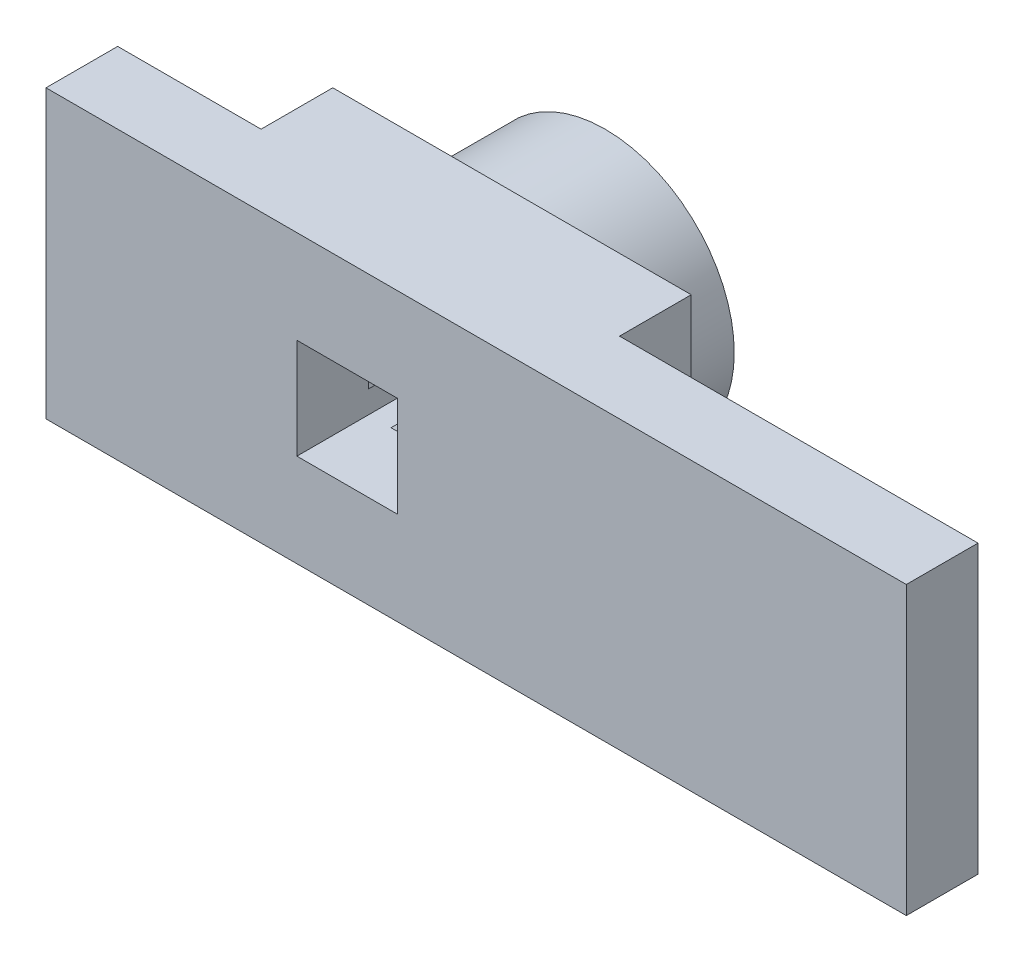
ISO-10303-21;
HEADER;
FILE_DESCRIPTION(('STEP AP214'),'2;1');
FILE_NAME('part.step','',(''),(''),'','','');
FILE_SCHEMA(('AUTOMOTIVE_DESIGN { 1 0 10303 214 1 1 1 1 }'));
ENDSEC;
DATA;
#1=APPLICATION_CONTEXT('core data for automotive mechanical design processes');
#2=APPLICATION_PROTOCOL_DEFINITION('international standard','automotive_design',2000,#1);
#3=PRODUCT_CONTEXT('',#1,'mechanical');
#4=PRODUCT('Part','Part','',(#3));
#5=PRODUCT_RELATED_PRODUCT_CATEGORY('part','',(#4));
#6=PRODUCT_DEFINITION_FORMATION('','',#4);
#7=PRODUCT_DEFINITION_CONTEXT('part definition',#1,'design');
#8=PRODUCT_DEFINITION('design','',#6,#7);
#9=PRODUCT_DEFINITION_SHAPE('','',#8);
#10=(LENGTH_UNIT() NAMED_UNIT(*) SI_UNIT(.MILLI.,.METRE.));
#11=(NAMED_UNIT(*) PLANE_ANGLE_UNIT() SI_UNIT($,.RADIAN.));
#12=(NAMED_UNIT(*) SI_UNIT($,.STERADIAN.) SOLID_ANGLE_UNIT());
#13=UNCERTAINTY_MEASURE_WITH_UNIT(LENGTH_MEASURE(1.E-05),#10,'distance_accuracy_value','');
#14=(GEOMETRIC_REPRESENTATION_CONTEXT(3) GLOBAL_UNCERTAINTY_ASSIGNED_CONTEXT((#13)) GLOBAL_UNIT_ASSIGNED_CONTEXT((#10,
#11,#12)) REPRESENTATION_CONTEXT('',''));
#15=CARTESIAN_POINT('',(0.,0.,0.));
#16=DIRECTION('',(0.,0.,1.));
#17=DIRECTION('',(1.,0.,0.));
#18=AXIS2_PLACEMENT_3D('',#15,#16,#17);
#19=CARTESIAN_POINT('',(-39.,10.,0.));
#20=DIRECTION('',(0.,0.,-1.));
#21=DIRECTION('',(-1.,0.,0.));
#22=AXIS2_PLACEMENT_3D('',#19,#20,#21);
#23=PLANE('',#22);
#24=DIRECTION('',(0.,-1.,0.));
#25=VECTOR('',#24,1.);
#26=CARTESIAN_POINT('',(-42.5,13.5,0.));
#27=LINE('',#26,#25);
#28=CARTESIAN_POINT('',(-42.5,13.5,0.));
#29=VERTEX_POINT('',#28);
#30=CARTESIAN_POINT('',(-42.5,11.9364916731037,0.));
#31=VERTEX_POINT('',#30);
#32=EDGE_CURVE('E239',#29,#31,#27,.T.);
#33=ORIENTED_EDGE('',*,*,#32,.T.);
#34=CARTESIAN_POINT('',(-39.,10.,0.));
#35=DIRECTION('',(0.,0.,-1.));
#36=DIRECTION('',(-1.,0.,0.));
#37=AXIS2_PLACEMENT_3D('',#34,#35,#36);
#38=CIRCLE('',#37,4.00000000000001);
#39=CARTESIAN_POINT('',(-40.9364916731037,13.5,0.));
#40=VERTEX_POINT('',#39);
#41=EDGE_CURVE('E173',#31,#40,#38,.T.);
#42=ORIENTED_EDGE('',*,*,#41,.T.);
#43=DIRECTION('',(-1.,0.,0.));
#44=VECTOR('',#43,1.);
#45=CARTESIAN_POINT('',(-42.5,13.5,0.));
#46=LINE('',#45,#44);
#47=EDGE_CURVE('E250',#40,#29,#46,.T.);
#48=ORIENTED_EDGE('',*,*,#47,.T.);
#49=EDGE_LOOP('',(#33,#42,#48));
#50=FACE_BOUND('',#49,.T.);
#51=ADVANCED_FACE('F33',(#50),#23,.F.);
#52=CARTESIAN_POINT('',(-35.5,13.5,0.));
#53=VERTEX_POINT('',#52);
#54=CARTESIAN_POINT('',(-37.0635083268963,13.5,0.));
#55=VERTEX_POINT('',#54);
#56=EDGE_CURVE('E251',#53,#55,#46,.T.);
#57=ORIENTED_EDGE('',*,*,#56,.T.);
#58=CARTESIAN_POINT('',(-35.5,11.9364916731037,0.));
#59=VERTEX_POINT('',#58);
#60=EDGE_CURVE('E386',#55,#59,#38,.T.);
#61=ORIENTED_EDGE('',*,*,#60,.T.);
#62=DIRECTION('',(0.,1.,0.));
#63=VECTOR('',#62,1.);
#64=CARTESIAN_POINT('',(-35.5,13.5,0.));
#65=LINE('',#64,#63);
#66=EDGE_CURVE('E246',#59,#53,#65,.T.);
#67=ORIENTED_EDGE('',*,*,#66,.T.);
#68=EDGE_LOOP('',(#57,#61,#67));
#69=FACE_BOUND('',#68,.T.);
#70=ADVANCED_FACE('F347',(#69),#23,.F.);
#71=CARTESIAN_POINT('',(-35.5,6.5,0.));
#72=VERTEX_POINT('',#71);
#73=CARTESIAN_POINT('',(-35.5,8.06350832689628,0.));
#74=VERTEX_POINT('',#73);
#75=EDGE_CURVE('E247',#72,#74,#65,.T.);
#76=ORIENTED_EDGE('',*,*,#75,.T.);
#77=CARTESIAN_POINT('',(-37.0635083268963,6.5,0.));
#78=VERTEX_POINT('',#77);
#79=EDGE_CURVE('E375',#74,#78,#38,.T.);
#80=ORIENTED_EDGE('',*,*,#79,.T.);
#81=DIRECTION('',(1.,0.,0.));
#82=VECTOR('',#81,1.);
#83=CARTESIAN_POINT('',(-42.5,6.5,0.));
#84=LINE('',#83,#82);
#85=EDGE_CURVE('E241',#78,#72,#84,.T.);
#86=ORIENTED_EDGE('',*,*,#85,.T.);
#87=EDGE_LOOP('',(#76,#80,#86));
#88=FACE_BOUND('',#87,.T.);
#89=ADVANCED_FACE('F345',(#88),#23,.F.);
#90=CARTESIAN_POINT('',(-60.,20.,10.));
#91=DIRECTION('',(1.,0.,0.));
#92=DIRECTION('',(0.,1.,0.));
#93=AXIS2_PLACEMENT_3D('',#90,#91,#92);
#94=PLANE('',#93);
#95=DIRECTION('',(0.,0.,-1.));
#96=VECTOR('',#95,1.);
#97=CARTESIAN_POINT('',(-60.,20.,10.));
#98=LINE('',#97,#96);
#99=CARTESIAN_POINT('',(-60.,20.,10.));
#100=VERTEX_POINT('',#99);
#101=CARTESIAN_POINT('',(-60.,20.,5.));
#102=VERTEX_POINT('',#101);
#103=EDGE_CURVE('E284',#100,#102,#98,.T.);
#104=ORIENTED_EDGE('',*,*,#103,.T.);
#105=DIRECTION('',(0.,-1.,0.));
#106=VECTOR('',#105,1.);
#107=CARTESIAN_POINT('',(-60.,20.,5.));
#108=LINE('',#107,#106);
#109=CARTESIAN_POINT('',(-60.,0.,5.));
#110=VERTEX_POINT('',#109);
#111=EDGE_CURVE('E232',#102,#110,#108,.T.);
#112=ORIENTED_EDGE('',*,*,#111,.T.);
#113=DIRECTION('',(0.,0.,-1.));
#114=VECTOR('',#113,1.);
#115=CARTESIAN_POINT('',(-60.,0.,10.));
#116=LINE('',#115,#114);
#117=CARTESIAN_POINT('',(-60.,0.,10.));
#118=VERTEX_POINT('',#117);
#119=EDGE_CURVE('E296',#118,#110,#116,.T.);
#120=ORIENTED_EDGE('',*,*,#119,.F.);
#121=DIRECTION('',(0.,-1.,0.));
#122=VECTOR('',#121,1.);
#123=CARTESIAN_POINT('',(-60.,20.,10.));
#124=LINE('',#123,#122);
#125=EDGE_CURVE('E274',#100,#118,#124,.T.);
#126=ORIENTED_EDGE('',*,*,#125,.F.);
#127=EDGE_LOOP('',(#104,#112,#120,#126));
#128=FACE_BOUND('',#127,.T.);
#129=ADVANCED_FACE('F35',(#128),#94,.F.);
#130=CARTESIAN_POINT('',(-60.,0.,10.));
#131=DIRECTION('',(0.,1.,0.));
#132=DIRECTION('',(0.,0.,1.));
#133=AXIS2_PLACEMENT_3D('',#130,#131,#132);
#134=PLANE('',#133);
#135=DIRECTION('',(1.,0.,0.));
#136=VECTOR('',#135,1.);
#137=CARTESIAN_POINT('',(-60.,0.,0.));
#138=LINE('',#137,#136);
#139=CARTESIAN_POINT('',(-50.,0.,0.));
#140=VERTEX_POINT('',#139);
#141=CARTESIAN_POINT('',(-25.,0.,0.));
#142=VERTEX_POINT('',#141);
#143=EDGE_CURVE('E267',#140,#142,#138,.T.);
#144=ORIENTED_EDGE('',*,*,#143,.T.);
#145=DIRECTION('',(0.,0.,-1.));
#146=VECTOR('',#145,1.);
#147=CARTESIAN_POINT('',(-25.,0.,4.99999999999999));
#148=LINE('',#147,#146);
#149=CARTESIAN_POINT('',(-25.,0.,4.99999999999999));
#150=VERTEX_POINT('',#149);
#151=EDGE_CURVE('E56',#150,#142,#148,.T.);
#152=ORIENTED_EDGE('',*,*,#151,.F.);
#153=DIRECTION('',(-1.,0.,0.));
#154=VECTOR('',#153,1.);
#155=CARTESIAN_POINT('',(-25.,0.,4.99999999999999));
#156=LINE('',#155,#154);
#157=CARTESIAN_POINT('',(0.,0.,5.));
#158=VERTEX_POINT('',#157);
#159=EDGE_CURVE('E204',#158,#150,#156,.T.);
#160=ORIENTED_EDGE('',*,*,#159,.F.);
#161=DIRECTION('',(0.,0.,-1.));
#162=VECTOR('',#161,1.);
#163=CARTESIAN_POINT('',(0.,0.,10.));
#164=LINE('',#163,#162);
#165=CARTESIAN_POINT('',(0.,0.,10.));
#166=VERTEX_POINT('',#165);
#167=EDGE_CURVE('E293',#166,#158,#164,.T.);
#168=ORIENTED_EDGE('',*,*,#167,.F.);
#169=DIRECTION('',(1.,0.,0.));
#170=VECTOR('',#169,1.);
#171=CARTESIAN_POINT('',(-60.,0.,10.));
#172=LINE('',#171,#170);
#173=EDGE_CURVE('E277',#118,#166,#172,.T.);
#174=ORIENTED_EDGE('',*,*,#173,.F.);
#175=ORIENTED_EDGE('',*,*,#119,.T.);
#176=DIRECTION('',(-1.,0.,0.));
#177=VECTOR('',#176,1.);
#178=CARTESIAN_POINT('',(-60.,0.,5.));
#179=LINE('',#178,#177);
#180=CARTESIAN_POINT('',(-50.,0.,5.));
#181=VERTEX_POINT('',#180);
#182=EDGE_CURVE('E225',#181,#110,#179,.T.);
#183=ORIENTED_EDGE('',*,*,#182,.F.);
#184=DIRECTION('',(0.,0.,1.));
#185=VECTOR('',#184,1.);
#186=CARTESIAN_POINT('',(-50.,0.,0.));
#187=LINE('',#186,#185);
#188=EDGE_CURVE('E217',#140,#181,#187,.T.);
#189=ORIENTED_EDGE('',*,*,#188,.F.);
#190=EDGE_LOOP('',(#144,#152,#160,#168,#174,#175,#183,#189));
#191=FACE_BOUND('',#190,.T.);
#192=ADVANCED_FACE('F338',(#191),#134,.F.);
#193=CARTESIAN_POINT('',(0.,20.,10.));
#194=DIRECTION('',(-1.,0.,0.));
#195=DIRECTION('',(0.,0.,1.));
#196=AXIS2_PLACEMENT_3D('',#193,#194,#195);
#197=PLANE('',#196);
#198=ORIENTED_EDGE('',*,*,#167,.T.);
#199=DIRECTION('',(0.,-1.,0.));
#200=VECTOR('',#199,1.);
#201=CARTESIAN_POINT('',(0.,20.,5.));
#202=LINE('',#201,#200);
#203=CARTESIAN_POINT('',(0.,20.,5.));
#204=VERTEX_POINT('',#203);
#205=EDGE_CURVE('E211',#204,#158,#202,.T.);
#206=ORIENTED_EDGE('',*,*,#205,.F.);
#207=DIRECTION('',(0.,0.,-1.));
#208=VECTOR('',#207,1.);
#209=CARTESIAN_POINT('',(0.,20.,10.));
#210=LINE('',#209,#208);
#211=CARTESIAN_POINT('',(0.,20.,10.));
#212=VERTEX_POINT('',#211);
#213=EDGE_CURVE('E290',#212,#204,#210,.T.);
#214=ORIENTED_EDGE('',*,*,#213,.F.);
#215=DIRECTION('',(0.,1.,0.));
#216=VECTOR('',#215,1.);
#217=CARTESIAN_POINT('',(0.,20.,10.));
#218=LINE('',#217,#216);
#219=EDGE_CURVE('E280',#166,#212,#218,.T.);
#220=ORIENTED_EDGE('',*,*,#219,.F.);
#221=EDGE_LOOP('',(#198,#206,#214,#220));
#222=FACE_BOUND('',#221,.T.);
#223=ADVANCED_FACE('F333',(#222),#197,.F.);
#224=CARTESIAN_POINT('',(-60.,20.,10.));
#225=DIRECTION('',(0.,-1.,0.));
#226=DIRECTION('',(0.,0.,-1.));
#227=AXIS2_PLACEMENT_3D('',#224,#225,#226);
#228=PLANE('',#227);
#229=DIRECTION('',(-1.,0.,0.));
#230=VECTOR('',#229,1.);
#231=CARTESIAN_POINT('',(-25.,20.,4.99999999999999));
#232=LINE('',#231,#230);
#233=CARTESIAN_POINT('',(-25.,20.,4.99999999999999));
#234=VERTEX_POINT('',#233);
#235=EDGE_CURVE('E205',#204,#234,#232,.T.);
#236=ORIENTED_EDGE('',*,*,#235,.T.);
#237=DIRECTION('',(0.,0.,-1.));
#238=VECTOR('',#237,1.);
#239=CARTESIAN_POINT('',(-25.,20.,4.99999999999999));
#240=LINE('',#239,#238);
#241=CARTESIAN_POINT('',(-25.,20.,0.));
#242=VERTEX_POINT('',#241);
#243=EDGE_CURVE('E208',#234,#242,#240,.T.);
#244=ORIENTED_EDGE('',*,*,#243,.T.);
#245=DIRECTION('',(-1.,0.,0.));
#246=VECTOR('',#245,1.);
#247=CARTESIAN_POINT('',(-60.,20.,0.));
#248=LINE('',#247,#246);
#249=CARTESIAN_POINT('',(-50.,20.,0.));
#250=VERTEX_POINT('',#249);
#251=EDGE_CURVE('E278',#242,#250,#248,.T.);
#252=ORIENTED_EDGE('',*,*,#251,.T.);
#253=DIRECTION('',(0.,0.,1.));
#254=VECTOR('',#253,1.);
#255=CARTESIAN_POINT('',(-50.,20.,0.));
#256=LINE('',#255,#254);
#257=CARTESIAN_POINT('',(-50.,20.,5.));
#258=VERTEX_POINT('',#257);
#259=EDGE_CURVE('E221',#250,#258,#256,.T.);
#260=ORIENTED_EDGE('',*,*,#259,.T.);
#261=DIRECTION('',(-1.,0.,0.));
#262=VECTOR('',#261,1.);
#263=CARTESIAN_POINT('',(-60.,20.,5.));
#264=LINE('',#263,#262);
#265=EDGE_CURVE('E224',#258,#102,#264,.T.);
#266=ORIENTED_EDGE('',*,*,#265,.T.);
#267=ORIENTED_EDGE('',*,*,#103,.F.);
#268=DIRECTION('',(-1.,0.,0.));
#269=VECTOR('',#268,1.);
#270=CARTESIAN_POINT('',(-60.,20.,10.));
#271=LINE('',#270,#269);
#272=EDGE_CURVE('E282',#212,#100,#271,.T.);
#273=ORIENTED_EDGE('',*,*,#272,.F.);
#274=ORIENTED_EDGE('',*,*,#213,.T.);
#275=EDGE_LOOP('',(#236,#244,#252,#260,#266,#267,#273,#274));
#276=FACE_BOUND('',#275,.T.);
#277=ADVANCED_FACE('F313',(#276),#228,.F.);
#278=CARTESIAN_POINT('',(0.,0.,10.));
#279=DIRECTION('',(0.,0.,1.));
#280=DIRECTION('',(1.,0.,0.));
#281=AXIS2_PLACEMENT_3D('',#278,#279,#280);
#282=PLANE('',#281);
#283=DIRECTION('',(0.,-1.,0.));
#284=VECTOR('',#283,1.);
#285=CARTESIAN_POINT('',(-42.5,13.5,10.));
#286=LINE('',#285,#284);
#287=CARTESIAN_POINT('',(-42.5,13.5,10.));
#288=VERTEX_POINT('',#287);
#289=CARTESIAN_POINT('',(-42.5,6.5,10.));
#290=VERTEX_POINT('',#289);
#291=EDGE_CURVE('E235',#288,#290,#286,.T.);
#292=ORIENTED_EDGE('',*,*,#291,.F.);
#293=DIRECTION('',(-1.,0.,0.));
#294=VECTOR('',#293,1.);
#295=CARTESIAN_POINT('',(-42.5,13.5,10.));
#296=LINE('',#295,#294);
#297=CARTESIAN_POINT('',(-35.5,13.5,10.));
#298=VERTEX_POINT('',#297);
#299=EDGE_CURVE('E262',#298,#288,#296,.T.);
#300=ORIENTED_EDGE('',*,*,#299,.F.);
#301=DIRECTION('',(0.,1.,0.));
#302=VECTOR('',#301,1.);
#303=CARTESIAN_POINT('',(-35.5,13.5,10.));
#304=LINE('',#303,#302);
#305=CARTESIAN_POINT('',(-35.5,6.5,10.));
#306=VERTEX_POINT('',#305);
#307=EDGE_CURVE('E259',#306,#298,#304,.T.);
#308=ORIENTED_EDGE('',*,*,#307,.F.);
#309=DIRECTION('',(1.,0.,0.));
#310=VECTOR('',#309,1.);
#311=CARTESIAN_POINT('',(-42.5,6.5,10.));
#312=LINE('',#311,#310);
#313=EDGE_CURVE('E256',#290,#306,#312,.T.);
#314=ORIENTED_EDGE('',*,*,#313,.F.);
#315=EDGE_LOOP('',(#292,#300,#308,#314));
#316=FACE_BOUND('',#315,.T.);
#317=ORIENTED_EDGE('',*,*,#125,.T.);
#318=ORIENTED_EDGE('',*,*,#173,.T.);
#319=ORIENTED_EDGE('',*,*,#219,.T.);
#320=ORIENTED_EDGE('',*,*,#272,.T.);
#321=EDGE_LOOP('',(#317,#318,#319,#320));
#322=FACE_BOUND('',#321,.T.);
#323=ADVANCED_FACE('F306',(#316,#322),#282,.T.);
#324=CARTESIAN_POINT('',(0.,0.,0.));
#325=DIRECTION('',(0.,0.,1.));
#326=DIRECTION('',(1.,0.,0.));
#327=AXIS2_PLACEMENT_3D('',#324,#325,#326);
#328=PLANE('',#327);
#329=CARTESIAN_POINT('',(-39.,10.,0.));
#330=DIRECTION('',(0.,0.,1.));
#331=DIRECTION('',(1.,0.,0.));
#332=AXIS2_PLACEMENT_3D('',#329,#330,#331);
#333=CIRCLE('',#332,9.);
#334=CARTESIAN_POINT('',(-30.,10.,0.));
#335=VERTEX_POINT('',#334);
#336=EDGE_CURVE('E41',#335,#335,#333,.F.);
#337=ORIENTED_EDGE('',*,*,#336,.F.);
#338=EDGE_LOOP('',(#337));
#339=FACE_BOUND('',#338,.T.);
#340=ORIENTED_EDGE('',*,*,#251,.F.);
#341=DIRECTION('',(0.,-1.,0.));
#342=VECTOR('',#341,1.);
#343=CARTESIAN_POINT('',(-25.,20.,0.));
#344=LINE('',#343,#342);
#345=EDGE_CURVE('E215',#242,#142,#344,.T.);
#346=ORIENTED_EDGE('',*,*,#345,.T.);
#347=ORIENTED_EDGE('',*,*,#143,.F.);
#348=DIRECTION('',(0.,-1.,0.));
#349=VECTOR('',#348,1.);
#350=CARTESIAN_POINT('',(-50.,20.,0.));
#351=LINE('',#350,#349);
#352=EDGE_CURVE('E228',#250,#140,#351,.T.);
#353=ORIENTED_EDGE('',*,*,#352,.F.);
#354=EDGE_LOOP('',(#340,#346,#347,#353));
#355=FACE_BOUND('',#354,.T.);
#356=ADVANCED_FACE('F303',(#339,#355),#328,.F.);
#357=CARTESIAN_POINT('',(-42.5,13.5,0.));
#358=DIRECTION('',(-1.,0.,0.));
#359=DIRECTION('',(0.,0.,1.));
#360=AXIS2_PLACEMENT_3D('',#357,#358,#359);
#361=PLANE('',#360);
#362=DIRECTION('',(0.,-1.,0.));
#363=VECTOR('',#362,1.);
#364=CARTESIAN_POINT('',(-42.5,13.5,5.));
#365=LINE('',#364,#363);
#366=CARTESIAN_POINT('',(-42.5,11.9364916731037,5.));
#367=VERTEX_POINT('',#366);
#368=CARTESIAN_POINT('',(-42.5,8.06350832689627,5.));
#369=VERTEX_POINT('',#368);
#370=EDGE_CURVE('E183',#367,#369,#365,.T.);
#371=ORIENTED_EDGE('',*,*,#370,.F.);
#372=DIRECTION('',(0.,0.,-1.));
#373=VECTOR('',#372,1.);
#374=CARTESIAN_POINT('',(-42.5,11.9364916731037,5.));
#375=LINE('',#374,#373);
#376=EDGE_CURVE('E168',#367,#31,#375,.T.);
#377=ORIENTED_EDGE('',*,*,#376,.T.);
#378=ORIENTED_EDGE('',*,*,#32,.F.);
#379=DIRECTION('',(0.,0.,1.));
#380=VECTOR('',#379,1.);
#381=CARTESIAN_POINT('',(-42.5,13.5,0.));
#382=LINE('',#381,#380);
#383=EDGE_CURVE('E265',#29,#288,#382,.T.);
#384=ORIENTED_EDGE('',*,*,#383,.T.);
#385=ORIENTED_EDGE('',*,*,#291,.T.);
#386=DIRECTION('',(0.,0.,1.));
#387=VECTOR('',#386,1.);
#388=CARTESIAN_POINT('',(-42.5,6.5,0.));
#389=LINE('',#388,#387);
#390=CARTESIAN_POINT('',(-42.5,6.5,0.));
#391=VERTEX_POINT('',#390);
#392=EDGE_CURVE('E254',#391,#290,#389,.T.);
#393=ORIENTED_EDGE('',*,*,#392,.F.);
#394=CARTESIAN_POINT('',(-42.5,8.06350832689627,0.));
#395=VERTEX_POINT('',#394);
#396=EDGE_CURVE('E242',#395,#391,#27,.T.);
#397=ORIENTED_EDGE('',*,*,#396,.F.);
#398=DIRECTION('',(0.,0.,-1.));
#399=VECTOR('',#398,1.);
#400=CARTESIAN_POINT('',(-42.5,8.06350832689627,5.));
#401=LINE('',#400,#399);
#402=EDGE_CURVE('E48',#395,#369,#401,.F.);
#403=ORIENTED_EDGE('',*,*,#402,.T.);
#404=EDGE_LOOP('',(#371,#377,#378,#384,#385,#393,#397,#403));
#405=FACE_BOUND('',#404,.T.);
#406=ADVANCED_FACE('F188',(#405),#361,.F.);
#407=CARTESIAN_POINT('',(-42.5,13.5,0.));
#408=DIRECTION('',(0.,1.,0.));
#409=DIRECTION('',(-1.,0.,0.));
#410=AXIS2_PLACEMENT_3D('',#407,#408,#409);
#411=PLANE('',#410);
#412=DIRECTION('',(-1.,0.,0.));
#413=VECTOR('',#412,1.);
#414=CARTESIAN_POINT('',(-42.5,13.5,5.));
#415=LINE('',#414,#413);
#416=CARTESIAN_POINT('',(-37.0635083268963,13.5,5.));
#417=VERTEX_POINT('',#416);
#418=CARTESIAN_POINT('',(-40.9364916731037,13.5,5.));
#419=VERTEX_POINT('',#418);
#420=EDGE_CURVE('E191',#417,#419,#415,.T.);
#421=ORIENTED_EDGE('',*,*,#420,.F.);
#422=DIRECTION('',(0.,0.,-1.));
#423=VECTOR('',#422,1.);
#424=CARTESIAN_POINT('',(-37.0635083268963,13.5,5.));
#425=LINE('',#424,#423);
#426=EDGE_CURVE('E397',#417,#55,#425,.T.);
#427=ORIENTED_EDGE('',*,*,#426,.T.);
#428=ORIENTED_EDGE('',*,*,#56,.F.);
#429=DIRECTION('',(0.,0.,1.));
#430=VECTOR('',#429,1.);
#431=CARTESIAN_POINT('',(-35.5,13.5,0.));
#432=LINE('',#431,#430);
#433=EDGE_CURVE('E268',#53,#298,#432,.T.);
#434=ORIENTED_EDGE('',*,*,#433,.T.);
#435=ORIENTED_EDGE('',*,*,#299,.T.);
#436=ORIENTED_EDGE('',*,*,#383,.F.);
#437=ORIENTED_EDGE('',*,*,#47,.F.);
#438=DIRECTION('',(0.,0.,-1.));
#439=VECTOR('',#438,1.);
#440=CARTESIAN_POINT('',(-40.9364916731037,13.5,5.));
#441=LINE('',#440,#439);
#442=EDGE_CURVE('E179',#40,#419,#441,.F.);
#443=ORIENTED_EDGE('',*,*,#442,.T.);
#444=EDGE_LOOP('',(#421,#427,#428,#434,#435,#436,#437,#443));
#445=FACE_BOUND('',#444,.T.);
#446=ADVANCED_FACE('F411',(#445),#411,.F.);
#447=CARTESIAN_POINT('',(-35.5,13.5,0.));
#448=DIRECTION('',(1.,0.,0.));
#449=DIRECTION('',(0.,0.,-1.));
#450=AXIS2_PLACEMENT_3D('',#447,#448,#449);
#451=PLANE('',#450);
#452=DIRECTION('',(0.,1.,0.));
#453=VECTOR('',#452,1.);
#454=CARTESIAN_POINT('',(-35.5,13.5,5.));
#455=LINE('',#454,#453);
#456=CARTESIAN_POINT('',(-35.5,8.06350832689628,5.));
#457=VERTEX_POINT('',#456);
#458=CARTESIAN_POINT('',(-35.5,11.9364916731037,5.));
#459=VERTEX_POINT('',#458);
#460=EDGE_CURVE('E178',#457,#459,#455,.T.);
#461=ORIENTED_EDGE('',*,*,#460,.F.);
#462=DIRECTION('',(0.,0.,-1.));
#463=VECTOR('',#462,1.);
#464=CARTESIAN_POINT('',(-35.5,8.06350832689628,5.));
#465=LINE('',#464,#463);
#466=EDGE_CURVE('E382',#457,#74,#465,.T.);
#467=ORIENTED_EDGE('',*,*,#466,.T.);
#468=ORIENTED_EDGE('',*,*,#75,.F.);
#469=DIRECTION('',(0.,0.,1.));
#470=VECTOR('',#469,1.);
#471=CARTESIAN_POINT('',(-35.5,6.5,0.));
#472=LINE('',#471,#470);
#473=EDGE_CURVE('E270',#72,#306,#472,.T.);
#474=ORIENTED_EDGE('',*,*,#473,.T.);
#475=ORIENTED_EDGE('',*,*,#307,.T.);
#476=ORIENTED_EDGE('',*,*,#433,.F.);
#477=ORIENTED_EDGE('',*,*,#66,.F.);
#478=DIRECTION('',(0.,0.,-1.));
#479=VECTOR('',#478,1.);
#480=CARTESIAN_POINT('',(-35.5,11.9364916731037,5.));
#481=LINE('',#480,#479);
#482=EDGE_CURVE('E390',#59,#459,#481,.F.);
#483=ORIENTED_EDGE('',*,*,#482,.T.);
#484=EDGE_LOOP('',(#461,#467,#468,#474,#475,#476,#477,#483));
#485=FACE_BOUND('',#484,.T.);
#486=ADVANCED_FACE('F381',(#485),#451,.F.);
#487=CARTESIAN_POINT('',(-42.5,6.5,0.));
#488=DIRECTION('',(0.,-1.,0.));
#489=DIRECTION('',(0.,0.,-1.));
#490=AXIS2_PLACEMENT_3D('',#487,#488,#489);
#491=PLANE('',#490);
#492=DIRECTION('',(1.,0.,0.));
#493=VECTOR('',#492,1.);
#494=CARTESIAN_POINT('',(-42.5,6.5,5.));
#495=LINE('',#494,#493);
#496=CARTESIAN_POINT('',(-40.9364916731037,6.5,5.));
#497=VERTEX_POINT('',#496);
#498=CARTESIAN_POINT('',(-37.0635083268963,6.5,5.));
#499=VERTEX_POINT('',#498);
#500=EDGE_CURVE('E11',#497,#499,#495,.T.);
#501=ORIENTED_EDGE('',*,*,#500,.F.);
#502=DIRECTION('',(0.,0.,-1.));
#503=VECTOR('',#502,1.);
#504=CARTESIAN_POINT('',(-40.9364916731037,6.5,5.));
#505=LINE('',#504,#503);
#506=CARTESIAN_POINT('',(-40.9364916731037,6.5,0.));
#507=VERTEX_POINT('',#506);
#508=EDGE_CURVE('E416',#497,#507,#505,.T.);
#509=ORIENTED_EDGE('',*,*,#508,.T.);
#510=EDGE_CURVE('E243',#391,#507,#84,.T.);
#511=ORIENTED_EDGE('',*,*,#510,.F.);
#512=ORIENTED_EDGE('',*,*,#392,.T.);
#513=ORIENTED_EDGE('',*,*,#313,.T.);
#514=ORIENTED_EDGE('',*,*,#473,.F.);
#515=ORIENTED_EDGE('',*,*,#85,.F.);
#516=DIRECTION('',(0.,0.,-1.));
#517=VECTOR('',#516,1.);
#518=CARTESIAN_POINT('',(-37.0635083268963,6.5,5.));
#519=LINE('',#518,#517);
#520=EDGE_CURVE('E387',#78,#499,#519,.F.);
#521=ORIENTED_EDGE('',*,*,#520,.T.);
#522=EDGE_LOOP('',(#501,#509,#511,#512,#513,#514,#515,#521));
#523=FACE_BOUND('',#522,.T.);
#524=ADVANCED_FACE('F424',(#523),#491,.F.);
#525=CARTESIAN_POINT('',(-60.,20.,5.));
#526=DIRECTION('',(0.,0.,1.));
#527=DIRECTION('',(1.,0.,0.));
#528=AXIS2_PLACEMENT_3D('',#525,#526,#527);
#529=PLANE('',#528);
#530=ORIENTED_EDGE('',*,*,#182,.T.);
#531=ORIENTED_EDGE('',*,*,#111,.F.);
#532=ORIENTED_EDGE('',*,*,#265,.F.);
#533=DIRECTION('',(0.,-1.,0.));
#534=VECTOR('',#533,1.);
#535=CARTESIAN_POINT('',(-50.,20.,5.));
#536=LINE('',#535,#534);
#537=EDGE_CURVE('E236',#258,#181,#536,.T.);
#538=ORIENTED_EDGE('',*,*,#537,.T.);
#539=EDGE_LOOP('',(#530,#531,#532,#538));
#540=FACE_BOUND('',#539,.T.);
#541=ADVANCED_FACE('F321',(#540),#529,.F.);
#542=CARTESIAN_POINT('',(-50.,20.,0.));
#543=DIRECTION('',(1.,0.,0.));
#544=DIRECTION('',(0.,0.,-1.));
#545=AXIS2_PLACEMENT_3D('',#542,#543,#544);
#546=PLANE('',#545);
#547=ORIENTED_EDGE('',*,*,#188,.T.);
#548=ORIENTED_EDGE('',*,*,#537,.F.);
#549=ORIENTED_EDGE('',*,*,#259,.F.);
#550=ORIENTED_EDGE('',*,*,#352,.T.);
#551=EDGE_LOOP('',(#547,#548,#549,#550));
#552=FACE_BOUND('',#551,.T.);
#553=ADVANCED_FACE('F316',(#552),#546,.F.);
#554=CARTESIAN_POINT('',(-25.,20.,4.99999999999999));
#555=DIRECTION('',(-1.,0.,0.));
#556=DIRECTION('',(0.,0.,1.));
#557=AXIS2_PLACEMENT_3D('',#554,#555,#556);
#558=PLANE('',#557);
#559=ORIENTED_EDGE('',*,*,#151,.T.);
#560=ORIENTED_EDGE('',*,*,#345,.F.);
#561=ORIENTED_EDGE('',*,*,#243,.F.);
#562=DIRECTION('',(0.,-1.,0.));
#563=VECTOR('',#562,1.);
#564=CARTESIAN_POINT('',(-25.,20.,4.99999999999999));
#565=LINE('',#564,#563);
#566=EDGE_CURVE('E218',#234,#150,#565,.T.);
#567=ORIENTED_EDGE('',*,*,#566,.T.);
#568=EDGE_LOOP('',(#559,#560,#561,#567));
#569=FACE_BOUND('',#568,.T.);
#570=ADVANCED_FACE('F366',(#569),#558,.F.);
#571=CARTESIAN_POINT('',(-25.,20.,4.99999999999999));
#572=DIRECTION('',(0.,0.,1.));
#573=DIRECTION('',(1.,0.,0.));
#574=AXIS2_PLACEMENT_3D('',#571,#572,#573);
#575=PLANE('',#574);
#576=ORIENTED_EDGE('',*,*,#159,.T.);
#577=ORIENTED_EDGE('',*,*,#566,.F.);
#578=ORIENTED_EDGE('',*,*,#235,.F.);
#579=ORIENTED_EDGE('',*,*,#205,.T.);
#580=EDGE_LOOP('',(#576,#577,#578,#579));
#581=FACE_BOUND('',#580,.T.);
#582=ADVANCED_FACE('F336',(#581),#575,.F.);
#583=ORIENTED_EDGE('',*,*,#510,.T.);
#584=EDGE_CURVE('E415',#507,#395,#38,.T.);
#585=ORIENTED_EDGE('',*,*,#584,.T.);
#586=ORIENTED_EDGE('',*,*,#396,.T.);
#587=EDGE_LOOP('',(#583,#585,#586));
#588=FACE_BOUND('',#587,.T.);
#589=ADVANCED_FACE('F350',(#588),#23,.F.);
#590=CARTESIAN_POINT('',(-39.,10.,-8.));
#591=DIRECTION('',(0.,0.,1.));
#592=DIRECTION('',(1.,0.,0.));
#593=AXIS2_PLACEMENT_3D('',#590,#591,#592);
#594=CYLINDRICAL_SURFACE('',#593,9.);
#595=CARTESIAN_POINT('',(-39.,10.,-8.));
#596=DIRECTION('',(0.,0.,-1.));
#597=DIRECTION('',(-1.,0.,0.));
#598=AXIS2_PLACEMENT_3D('',#595,#596,#597);
#599=CIRCLE('',#598,9.);
#600=CARTESIAN_POINT('',(-48.,10.,-8.));
#601=VERTEX_POINT('',#600);
#602=EDGE_CURVE('E200',#601,#601,#599,.T.);
#603=ORIENTED_EDGE('',*,*,#602,.F.);
#604=EDGE_LOOP('',(#603));
#605=FACE_BOUND('',#604,.T.);
#606=ORIENTED_EDGE('',*,*,#336,.T.);
#607=EDGE_LOOP('',(#606));
#608=FACE_BOUND('',#607,.T.);
#609=ADVANCED_FACE('F301',(#605,#608),#594,.T.);
#610=CARTESIAN_POINT('',(-39.,10.,-8.));
#611=DIRECTION('',(0.,0.,-1.));
#612=DIRECTION('',(-1.,0.,0.));
#613=AXIS2_PLACEMENT_3D('',#610,#611,#612);
#614=PLANE('',#613);
#615=CARTESIAN_POINT('',(-39.,10.,-8.));
#616=DIRECTION('',(0.,0.,-1.));
#617=DIRECTION('',(-1.,0.,0.));
#618=AXIS2_PLACEMENT_3D('',#615,#616,#617);
#619=CIRCLE('',#618,6.51000000000001);
#620=CARTESIAN_POINT('',(-45.51,10.,-8.));
#621=VERTEX_POINT('',#620);
#622=EDGE_CURVE('E190',#621,#621,#619,.T.);
#623=ORIENTED_EDGE('',*,*,#622,.F.);
#624=EDGE_LOOP('',(#623));
#625=FACE_BOUND('',#624,.T.);
#626=ORIENTED_EDGE('',*,*,#602,.T.);
#627=EDGE_LOOP('',(#626));
#628=FACE_BOUND('',#627,.T.);
#629=ADVANCED_FACE('F364',(#625,#628),#614,.T.);
#630=CARTESIAN_POINT('',(-39.,10.,-3.));
#631=DIRECTION('',(0.,0.,-1.));
#632=DIRECTION('',(-1.,0.,0.));
#633=AXIS2_PLACEMENT_3D('',#630,#631,#632);
#634=CYLINDRICAL_SURFACE('',#633,6.51000000000001);
#635=CARTESIAN_POINT('',(-39.,10.,-3.));
#636=DIRECTION('',(0.,0.,-1.));
#637=DIRECTION('',(-1.,0.,0.));
#638=AXIS2_PLACEMENT_3D('',#635,#636,#637);
#639=CIRCLE('',#638,6.51000000000001);
#640=CARTESIAN_POINT('',(-45.51,10.,-3.));
#641=VERTEX_POINT('',#640);
#642=EDGE_CURVE('E194',#641,#641,#639,.T.);
#643=ORIENTED_EDGE('',*,*,#642,.F.);
#644=EDGE_LOOP('',(#643));
#645=FACE_BOUND('',#644,.T.);
#646=ORIENTED_EDGE('',*,*,#622,.T.);
#647=EDGE_LOOP('',(#646));
#648=FACE_BOUND('',#647,.T.);
#649=ADVANCED_FACE('F480',(#645,#648),#634,.F.);
#650=CARTESIAN_POINT('',(-39.,10.,-3.));
#651=DIRECTION('',(0.,0.,-1.));
#652=DIRECTION('',(-1.,0.,0.));
#653=AXIS2_PLACEMENT_3D('',#650,#651,#652);
#654=PLANE('',#653);
#655=CARTESIAN_POINT('',(-39.,10.,-3.));
#656=DIRECTION('',(0.,0.,-1.));
#657=DIRECTION('',(-1.,0.,0.));
#658=AXIS2_PLACEMENT_3D('',#655,#656,#657);
#659=CIRCLE('',#658,4.00000000000001);
#660=CARTESIAN_POINT('',(-43.,10.,-3.));
#661=VERTEX_POINT('',#660);
#662=EDGE_CURVE('E185',#661,#661,#659,.T.);
#663=ORIENTED_EDGE('',*,*,#662,.F.);
#664=EDGE_LOOP('',(#663));
#665=FACE_BOUND('',#664,.T.);
#666=ORIENTED_EDGE('',*,*,#642,.T.);
#667=EDGE_LOOP('',(#666));
#668=FACE_BOUND('',#667,.T.);
#669=ADVANCED_FACE('F488',(#665,#668),#654,.T.);
#670=CARTESIAN_POINT('',(-39.,10.,5.));
#671=DIRECTION('',(0.,0.,-1.));
#672=DIRECTION('',(-1.,0.,0.));
#673=AXIS2_PLACEMENT_3D('',#670,#671,#672);
#674=PLANE('',#673);
#675=ORIENTED_EDGE('',*,*,#370,.T.);
#676=CARTESIAN_POINT('',(-39.,10.,5.));
#677=DIRECTION('',(0.,0.,-1.));
#678=DIRECTION('',(-1.,0.,0.));
#679=AXIS2_PLACEMENT_3D('',#676,#677,#678);
#680=CIRCLE('',#679,4.00000000000001);
#681=EDGE_CURVE('E171',#369,#367,#680,.T.);
#682=ORIENTED_EDGE('',*,*,#681,.T.);
#683=EDGE_LOOP('',(#675,#682));
#684=FACE_BOUND('',#683,.T.);
#685=ADVANCED_FACE('F182',(#684),#674,.T.);
#686=ORIENTED_EDGE('',*,*,#420,.T.);
#687=EDGE_CURVE('E187',#419,#417,#680,.T.);
#688=ORIENTED_EDGE('',*,*,#687,.T.);
#689=EDGE_LOOP('',(#686,#688));
#690=FACE_BOUND('',#689,.T.);
#691=ADVANCED_FACE('F414',(#690),#674,.T.);
#692=ORIENTED_EDGE('',*,*,#460,.T.);
#693=EDGE_CURVE('E403',#459,#457,#680,.T.);
#694=ORIENTED_EDGE('',*,*,#693,.T.);
#695=EDGE_LOOP('',(#692,#694));
#696=FACE_BOUND('',#695,.T.);
#697=ADVANCED_FACE('F402',(#696),#674,.T.);
#698=ORIENTED_EDGE('',*,*,#500,.T.);
#699=EDGE_CURVE('E184',#499,#497,#680,.T.);
#700=ORIENTED_EDGE('',*,*,#699,.T.);
#701=EDGE_LOOP('',(#698,#700));
#702=FACE_BOUND('',#701,.T.);
#703=ADVANCED_FACE('F551',(#702),#674,.T.);
#704=CARTESIAN_POINT('',(-39.,10.,5.));
#705=DIRECTION('',(0.,0.,-1.));
#706=DIRECTION('',(-1.,0.,0.));
#707=AXIS2_PLACEMENT_3D('',#704,#705,#706);
#708=CYLINDRICAL_SURFACE('',#707,4.00000000000001);
#709=ORIENTED_EDGE('',*,*,#662,.T.);
#710=EDGE_LOOP('',(#709));
#711=FACE_BOUND('',#710,.T.);
#712=ORIENTED_EDGE('',*,*,#681,.F.);
#713=ORIENTED_EDGE('',*,*,#402,.F.);
#714=ORIENTED_EDGE('',*,*,#584,.F.);
#715=ORIENTED_EDGE('',*,*,#508,.F.);
#716=ORIENTED_EDGE('',*,*,#699,.F.);
#717=ORIENTED_EDGE('',*,*,#520,.F.);
#718=ORIENTED_EDGE('',*,*,#79,.F.);
#719=ORIENTED_EDGE('',*,*,#466,.F.);
#720=ORIENTED_EDGE('',*,*,#693,.F.);
#721=ORIENTED_EDGE('',*,*,#482,.F.);
#722=ORIENTED_EDGE('',*,*,#60,.F.);
#723=ORIENTED_EDGE('',*,*,#426,.F.);
#724=ORIENTED_EDGE('',*,*,#687,.F.);
#725=ORIENTED_EDGE('',*,*,#442,.F.);
#726=ORIENTED_EDGE('',*,*,#41,.F.);
#727=ORIENTED_EDGE('',*,*,#376,.F.);
#728=EDGE_LOOP('',(#712,#713,#714,#715,#716,#717,#718,#719,#720,#721,#722,#723,#724,#725,#726,#727));
#729=FACE_BOUND('',#728,.T.);
#730=ADVANCED_FACE('F170',(#711,#729),#708,.F.);
#731=CLOSED_SHELL('',(#51,#70,#89,#129,#192,#223,#277,#323,#356,#406,#446,#486,#524,#541,#553,
#570,#582,#589,#609,#629,#649,#669,#685,#691,#697,#703,#730));
#732=MANIFOLD_SOLID_BREP('B2',#731);
#733=ADVANCED_BREP_SHAPE_REPRESENTATION('',(#18,#732),#14);
#734=SHAPE_DEFINITION_REPRESENTATION(#9,#733);
ENDSEC;
END-ISO-10303-21;
